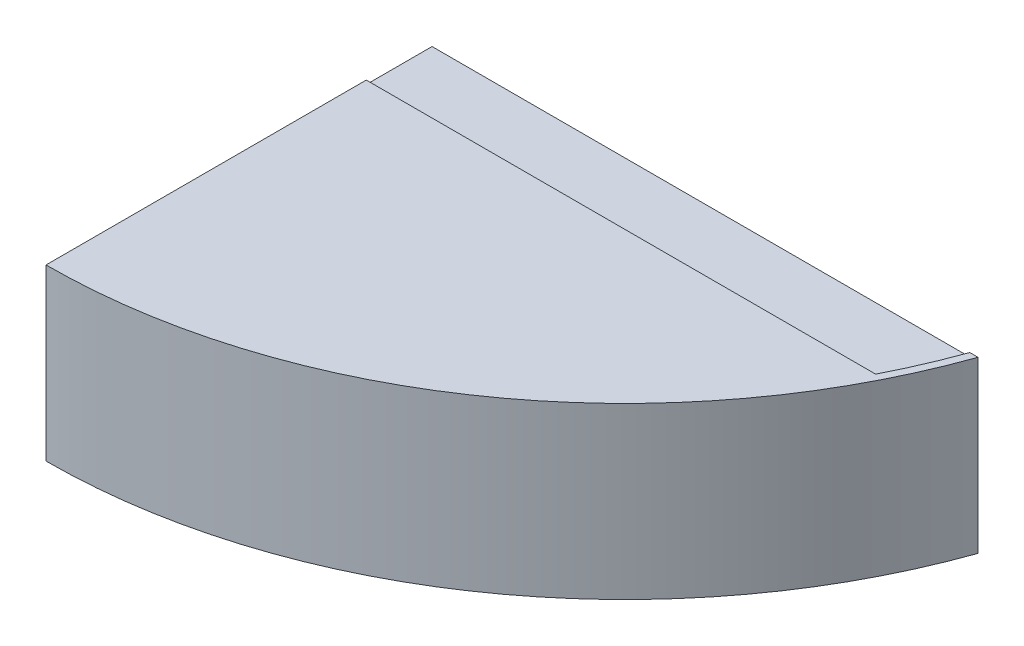
ISO-10303-21;
HEADER;
FILE_DESCRIPTION(('STEP AP214'),'2;1');
FILE_NAME('part.step','',(''),(''),'','','');
FILE_SCHEMA(('AUTOMOTIVE_DESIGN { 1 0 10303 214 1 1 1 1 }'));
ENDSEC;
DATA;
#1=APPLICATION_CONTEXT('core data for automotive mechanical design processes');
#2=APPLICATION_PROTOCOL_DEFINITION('international standard','automotive_design',2000,#1);
#3=PRODUCT_CONTEXT('',#1,'mechanical');
#4=PRODUCT('Part','Part','',(#3));
#5=PRODUCT_RELATED_PRODUCT_CATEGORY('part','',(#4));
#6=PRODUCT_DEFINITION_FORMATION('','',#4);
#7=PRODUCT_DEFINITION_CONTEXT('part definition',#1,'design');
#8=PRODUCT_DEFINITION('design','',#6,#7);
#9=PRODUCT_DEFINITION_SHAPE('','',#8);
#10=(LENGTH_UNIT() NAMED_UNIT(*) SI_UNIT(.MILLI.,.METRE.));
#11=(NAMED_UNIT(*) PLANE_ANGLE_UNIT() SI_UNIT($,.RADIAN.));
#12=(NAMED_UNIT(*) SI_UNIT($,.STERADIAN.) SOLID_ANGLE_UNIT());
#13=UNCERTAINTY_MEASURE_WITH_UNIT(LENGTH_MEASURE(1.E-05),#10,'distance_accuracy_value','');
#14=(GEOMETRIC_REPRESENTATION_CONTEXT(3) GLOBAL_UNCERTAINTY_ASSIGNED_CONTEXT((#13)) GLOBAL_UNIT_ASSIGNED_CONTEXT((#10,
#11,#12)) REPRESENTATION_CONTEXT('',''));
#15=CARTESIAN_POINT('',(0.,0.,0.));
#16=DIRECTION('',(0.,0.,1.));
#17=DIRECTION('',(1.,0.,0.));
#18=AXIS2_PLACEMENT_3D('',#15,#16,#17);
#19=CARTESIAN_POINT('',(0.,44.,0.));
#20=DIRECTION('',(0.,-1.,0.));
#21=DIRECTION('',(0.,0.,-1.));
#22=AXIS2_PLACEMENT_3D('',#19,#20,#21);
#23=CYLINDRICAL_SURFACE('',#22,150.);
#24=CARTESIAN_POINT('',(0.,0.,0.));
#25=DIRECTION('',(0.,1.,0.));
#26=DIRECTION('',(0.,0.,1.));
#27=AXIS2_PLACEMENT_3D('',#24,#25,#26);
#28=CIRCLE('',#27,150.);
#29=CARTESIAN_POINT('',(0.,0.,150.));
#30=VERTEX_POINT('',#29);
#31=CARTESIAN_POINT('',(141.42135623731,0.,50.));
#32=VERTEX_POINT('',#31);
#33=EDGE_CURVE('E139',#30,#32,#28,.T.);
#34=ORIENTED_EDGE('',*,*,#33,.T.);
#35=DIRECTION('',(0.,-1.,0.));
#36=VECTOR('',#35,1.);
#37=CARTESIAN_POINT('',(141.42135623731,44.,50.));
#38=LINE('',#37,#36);
#39=CARTESIAN_POINT('',(141.42135623731,44.,50.));
#40=VERTEX_POINT('',#39);
#41=EDGE_CURVE('E11',#40,#32,#38,.T.);
#42=ORIENTED_EDGE('',*,*,#41,.F.);
#43=CARTESIAN_POINT('',(0.,44.,0.));
#44=DIRECTION('',(0.,1.,0.));
#45=DIRECTION('',(0.,0.,1.));
#46=AXIS2_PLACEMENT_3D('',#43,#44,#45);
#47=CIRCLE('',#46,150.);
#48=CARTESIAN_POINT('',(0.,44.,150.));
#49=VERTEX_POINT('',#48);
#50=EDGE_CURVE('E140',#49,#40,#47,.T.);
#51=ORIENTED_EDGE('',*,*,#50,.F.);
#52=DIRECTION('',(0.,-1.,0.));
#53=VECTOR('',#52,1.);
#54=CARTESIAN_POINT('',(0.,44.,150.));
#55=LINE('',#54,#53);
#56=EDGE_CURVE('E148',#49,#30,#55,.T.);
#57=ORIENTED_EDGE('',*,*,#56,.T.);
#58=EDGE_LOOP('',(#34,#42,#51,#57));
#59=FACE_BOUND('',#58,.T.);
#60=ADVANCED_FACE('F33',(#59),#23,.T.);
#61=CARTESIAN_POINT('',(0.,44.,50.));
#62=DIRECTION('',(0.,0.,1.));
#63=DIRECTION('',(1.,0.,0.));
#64=AXIS2_PLACEMENT_3D('',#61,#62,#63);
#65=PLANE('',#64);
#66=DIRECTION('',(-1.,0.,0.));
#67=VECTOR('',#66,1.);
#68=CARTESIAN_POINT('',(0.,43.,50.));
#69=LINE('',#68,#67);
#70=CARTESIAN_POINT('',(139.298241194927,43.,50.));
#71=VERTEX_POINT('',#70);
#72=CARTESIAN_POINT('',(0.,43.,50.));
#73=VERTEX_POINT('',#72);
#74=EDGE_CURVE('E110',#71,#73,#69,.T.);
#75=ORIENTED_EDGE('',*,*,#74,.F.);
#76=DIRECTION('',(0.,1.,0.));
#77=VECTOR('',#76,1.);
#78=CARTESIAN_POINT('',(139.298241194927,43.,50.));
#79=LINE('',#78,#77);
#80=CARTESIAN_POINT('',(139.298241194927,44.,50.));
#81=VERTEX_POINT('',#80);
#82=EDGE_CURVE('E120',#71,#81,#79,.T.);
#83=ORIENTED_EDGE('',*,*,#82,.T.);
#84=DIRECTION('',(-1.,0.,0.));
#85=VECTOR('',#84,1.);
#86=CARTESIAN_POINT('',(0.,44.,50.));
#87=LINE('',#86,#85);
#88=EDGE_CURVE('E143',#40,#81,#87,.T.);
#89=ORIENTED_EDGE('',*,*,#88,.F.);
#90=ORIENTED_EDGE('',*,*,#41,.T.);
#91=DIRECTION('',(-1.,0.,0.));
#92=VECTOR('',#91,1.);
#93=CARTESIAN_POINT('',(0.,0.,50.));
#94=LINE('',#93,#92);
#95=CARTESIAN_POINT('',(139.298241194927,0.,50.));
#96=VERTEX_POINT('',#95);
#97=EDGE_CURVE('E151',#32,#96,#94,.T.);
#98=ORIENTED_EDGE('',*,*,#97,.T.);
#99=DIRECTION('',(0.,-1.,0.));
#100=VECTOR('',#99,1.);
#101=CARTESIAN_POINT('',(139.298241194927,42.,50.));
#102=LINE('',#101,#100);
#103=CARTESIAN_POINT('',(139.298241194927,42.,50.));
#104=VERTEX_POINT('',#103);
#105=EDGE_CURVE('E55',#104,#96,#102,.T.);
#106=ORIENTED_EDGE('',*,*,#105,.F.);
#107=DIRECTION('',(-1.,0.,0.));
#108=VECTOR('',#107,1.);
#109=CARTESIAN_POINT('',(0.,42.,50.));
#110=LINE('',#109,#108);
#111=CARTESIAN_POINT('',(0.,42.,50.));
#112=VERTEX_POINT('',#111);
#113=EDGE_CURVE('E127',#104,#112,#110,.T.);
#114=ORIENTED_EDGE('',*,*,#113,.T.);
#115=DIRECTION('',(0.,-1.,0.));
#116=VECTOR('',#115,1.);
#117=CARTESIAN_POINT('',(0.,44.,50.));
#118=LINE('',#117,#116);
#119=EDGE_CURVE('E40',#73,#112,#118,.T.);
#120=ORIENTED_EDGE('',*,*,#119,.F.);
#121=EDGE_LOOP('',(#75,#83,#89,#90,#98,#106,#114,#120));
#122=FACE_BOUND('',#121,.T.);
#123=ADVANCED_FACE('F161',(#122),#65,.F.);
#124=CARTESIAN_POINT('',(0.,44.,150.));
#125=DIRECTION('',(1.,0.,0.));
#126=DIRECTION('',(0.,0.,-1.));
#127=AXIS2_PLACEMENT_3D('',#124,#125,#126);
#128=PLANE('',#127);
#129=DIRECTION('',(0.,0.,1.));
#130=VECTOR('',#129,1.);
#131=CARTESIAN_POINT('',(0.,44.,150.));
#132=LINE('',#131,#130);
#133=CARTESIAN_POINT('',(0.,44.,67.0409461170474));
#134=VERTEX_POINT('',#133);
#135=EDGE_CURVE('E118',#134,#49,#132,.T.);
#136=ORIENTED_EDGE('',*,*,#135,.F.);
#137=DIRECTION('',(0.,1.,0.));
#138=VECTOR('',#137,1.);
#139=CARTESIAN_POINT('',(0.,43.,67.0409461170474));
#140=LINE('',#139,#138);
#141=CARTESIAN_POINT('',(0.,43.,67.0409461170474));
#142=VERTEX_POINT('',#141);
#143=EDGE_CURVE('E47',#142,#134,#140,.T.);
#144=ORIENTED_EDGE('',*,*,#143,.F.);
#145=DIRECTION('',(0.,0.,1.));
#146=VECTOR('',#145,1.);
#147=CARTESIAN_POINT('',(0.,43.,67.0409461170474));
#148=LINE('',#147,#146);
#149=EDGE_CURVE('E105',#73,#142,#148,.T.);
#150=ORIENTED_EDGE('',*,*,#149,.F.);
#151=ORIENTED_EDGE('',*,*,#119,.T.);
#152=DIRECTION('',(0.,0.,1.));
#153=VECTOR('',#152,1.);
#154=CARTESIAN_POINT('',(0.,42.,150.));
#155=LINE('',#154,#153);
#156=CARTESIAN_POINT('',(0.,42.,148.));
#157=VERTEX_POINT('',#156);
#158=EDGE_CURVE('E133',#112,#157,#155,.T.);
#159=ORIENTED_EDGE('',*,*,#158,.T.);
#160=DIRECTION('',(0.,-1.,0.));
#161=VECTOR('',#160,1.);
#162=CARTESIAN_POINT('',(0.,42.,148.));
#163=LINE('',#162,#161);
#164=CARTESIAN_POINT('',(0.,0.,148.));
#165=VERTEX_POINT('',#164);
#166=EDGE_CURVE('E130',#157,#165,#163,.T.);
#167=ORIENTED_EDGE('',*,*,#166,.T.);
#168=DIRECTION('',(0.,0.,1.));
#169=VECTOR('',#168,1.);
#170=CARTESIAN_POINT('',(0.,0.,150.));
#171=LINE('',#170,#169);
#172=EDGE_CURVE('E144',#165,#30,#171,.T.);
#173=ORIENTED_EDGE('',*,*,#172,.T.);
#174=ORIENTED_EDGE('',*,*,#56,.F.);
#175=EDGE_LOOP('',(#136,#144,#150,#151,#159,#167,#173,#174));
#176=FACE_BOUND('',#175,.T.);
#177=ADVANCED_FACE('F116',(#176),#128,.F.);
#178=CARTESIAN_POINT('',(0.,44.,0.));
#179=DIRECTION('',(0.,1.,0.));
#180=DIRECTION('',(0.,0.,1.));
#181=AXIS2_PLACEMENT_3D('',#178,#179,#180);
#182=PLANE('',#181);
#183=CARTESIAN_POINT('',(-9.51738687859915E-11,44.,-4.12586631526324E-11));
#184=DIRECTION('',(0.,1.,0.));
#185=DIRECTION('',(0.,0.,-1.));
#186=AXIS2_PLACEMENT_3D('',#183,#184,#185);
#187=CIRCLE('',#186,148.000000000104);
#188=CARTESIAN_POINT('',(131.945108070482,44.,67.0409461170474));
#189=VERTEX_POINT('',#188);
#190=EDGE_CURVE('E113',#189,#81,#187,.T.);
#191=ORIENTED_EDGE('',*,*,#190,.F.);
#192=DIRECTION('',(1.,0.,0.));
#193=VECTOR('',#192,1.);
#194=CARTESIAN_POINT('',(0.,44.,67.0409461170474));
#195=LINE('',#194,#193);
#196=EDGE_CURVE('E173',#134,#189,#195,.T.);
#197=ORIENTED_EDGE('',*,*,#196,.F.);
#198=ORIENTED_EDGE('',*,*,#135,.T.);
#199=ORIENTED_EDGE('',*,*,#50,.T.);
#200=ORIENTED_EDGE('',*,*,#88,.T.);
#201=EDGE_LOOP('',(#191,#197,#198,#199,#200));
#202=FACE_BOUND('',#201,.T.);
#203=ADVANCED_FACE('F172',(#202),#182,.T.);
#204=CARTESIAN_POINT('',(0.,0.,0.));
#205=DIRECTION('',(0.,1.,0.));
#206=DIRECTION('',(0.,0.,1.));
#207=AXIS2_PLACEMENT_3D('',#204,#205,#206);
#208=PLANE('',#207);
#209=ORIENTED_EDGE('',*,*,#172,.F.);
#210=CARTESIAN_POINT('',(0.,0.,0.));
#211=DIRECTION('',(0.,1.,0.));
#212=DIRECTION('',(0.,0.,1.));
#213=AXIS2_PLACEMENT_3D('',#210,#211,#212);
#214=CIRCLE('',#213,148.);
#215=EDGE_CURVE('E128',#165,#96,#214,.T.);
#216=ORIENTED_EDGE('',*,*,#215,.T.);
#217=ORIENTED_EDGE('',*,*,#97,.F.);
#218=ORIENTED_EDGE('',*,*,#33,.F.);
#219=EDGE_LOOP('',(#209,#216,#217,#218));
#220=FACE_BOUND('',#219,.T.);
#221=ADVANCED_FACE('F166',(#220),#208,.F.);
#222=CARTESIAN_POINT('',(0.,44.,0.));
#223=DIRECTION('',(0.,-1.,0.));
#224=DIRECTION('',(0.,0.,-1.));
#225=AXIS2_PLACEMENT_3D('',#222,#223,#224);
#226=CYLINDRICAL_SURFACE('',#225,148.);
#227=ORIENTED_EDGE('',*,*,#215,.F.);
#228=ORIENTED_EDGE('',*,*,#166,.F.);
#229=CARTESIAN_POINT('',(0.,42.,0.));
#230=DIRECTION('',(0.,1.,0.));
#231=DIRECTION('',(0.,0.,1.));
#232=AXIS2_PLACEMENT_3D('',#229,#230,#231);
#233=CIRCLE('',#232,148.);
#234=EDGE_CURVE('E125',#157,#104,#233,.T.);
#235=ORIENTED_EDGE('',*,*,#234,.T.);
#236=ORIENTED_EDGE('',*,*,#105,.T.);
#237=EDGE_LOOP('',(#227,#228,#235,#236));
#238=FACE_BOUND('',#237,.T.);
#239=ADVANCED_FACE('F167',(#238),#226,.F.);
#240=CARTESIAN_POINT('',(0.,42.,0.));
#241=DIRECTION('',(0.,1.,0.));
#242=DIRECTION('',(0.,0.,1.));
#243=AXIS2_PLACEMENT_3D('',#240,#241,#242);
#244=PLANE('',#243);
#245=ORIENTED_EDGE('',*,*,#234,.F.);
#246=ORIENTED_EDGE('',*,*,#158,.F.);
#247=ORIENTED_EDGE('',*,*,#113,.F.);
#248=EDGE_LOOP('',(#245,#246,#247));
#249=FACE_BOUND('',#248,.T.);
#250=ADVANCED_FACE('F160',(#249),#244,.F.);
#251=CARTESIAN_POINT('',(-9.51738687859915E-11,43.,-4.12586631526324E-11));
#252=DIRECTION('',(0.,1.,0.));
#253=DIRECTION('',(0.,0.,1.));
#254=AXIS2_PLACEMENT_3D('',#251,#252,#253);
#255=CYLINDRICAL_SURFACE('',#254,148.000000000104);
#256=ORIENTED_EDGE('',*,*,#190,.T.);
#257=ORIENTED_EDGE('',*,*,#82,.F.);
#258=CARTESIAN_POINT('',(-9.51738687859915E-11,43.,-4.12586631526324E-11));
#259=DIRECTION('',(0.,1.,0.));
#260=DIRECTION('',(0.,0.,-1.));
#261=AXIS2_PLACEMENT_3D('',#258,#259,#260);
#262=CIRCLE('',#261,148.000000000104);
#263=CARTESIAN_POINT('',(131.945108070482,43.,67.0409461170474));
#264=VERTEX_POINT('',#263);
#265=EDGE_CURVE('E104',#264,#71,#262,.T.);
#266=ORIENTED_EDGE('',*,*,#265,.F.);
#267=DIRECTION('',(0.,1.,0.));
#268=VECTOR('',#267,1.);
#269=CARTESIAN_POINT('',(131.945108070482,43.,67.0409461170474));
#270=LINE('',#269,#268);
#271=EDGE_CURVE('E100',#264,#189,#270,.T.);
#272=ORIENTED_EDGE('',*,*,#271,.T.);
#273=EDGE_LOOP('',(#256,#257,#266,#272));
#274=FACE_BOUND('',#273,.T.);
#275=ADVANCED_FACE('F179',(#274),#255,.F.);
#276=CARTESIAN_POINT('',(0.,43.,67.0409461170474));
#277=DIRECTION('',(0.,0.,1.));
#278=DIRECTION('',(1.,0.,0.));
#279=AXIS2_PLACEMENT_3D('',#276,#277,#278);
#280=PLANE('',#279);
#281=ORIENTED_EDGE('',*,*,#196,.T.);
#282=ORIENTED_EDGE('',*,*,#271,.F.);
#283=DIRECTION('',(1.,0.,0.));
#284=VECTOR('',#283,1.);
#285=CARTESIAN_POINT('',(0.,43.,67.0409461170474));
#286=LINE('',#285,#284);
#287=EDGE_CURVE('E97',#142,#264,#286,.T.);
#288=ORIENTED_EDGE('',*,*,#287,.F.);
#289=ORIENTED_EDGE('',*,*,#143,.T.);
#290=EDGE_LOOP('',(#281,#282,#288,#289));
#291=FACE_BOUND('',#290,.T.);
#292=ADVANCED_FACE('F99',(#291),#280,.F.);
#293=CARTESIAN_POINT('',(-9.51738687859915E-11,43.,-4.12586631526324E-11));
#294=DIRECTION('',(0.,-1.,0.));
#295=DIRECTION('',(0.,0.,-1.));
#296=AXIS2_PLACEMENT_3D('',#293,#294,#295);
#297=PLANE('',#296);
#298=ORIENTED_EDGE('',*,*,#149,.T.);
#299=ORIENTED_EDGE('',*,*,#287,.T.);
#300=ORIENTED_EDGE('',*,*,#265,.T.);
#301=ORIENTED_EDGE('',*,*,#74,.T.);
#302=EDGE_LOOP('',(#298,#299,#300,#301));
#303=FACE_BOUND('',#302,.T.);
#304=ADVANCED_FACE('F108',(#303),#297,.F.);
#305=CLOSED_SHELL('',(#60,#123,#177,#203,#221,#239,#250,#275,#292,#304));
#306=MANIFOLD_SOLID_BREP('B2',#305);
#307=ADVANCED_BREP_SHAPE_REPRESENTATION('',(#18,#306),#14);
#308=SHAPE_DEFINITION_REPRESENTATION(#9,#307);
ENDSEC;
END-ISO-10303-21;
